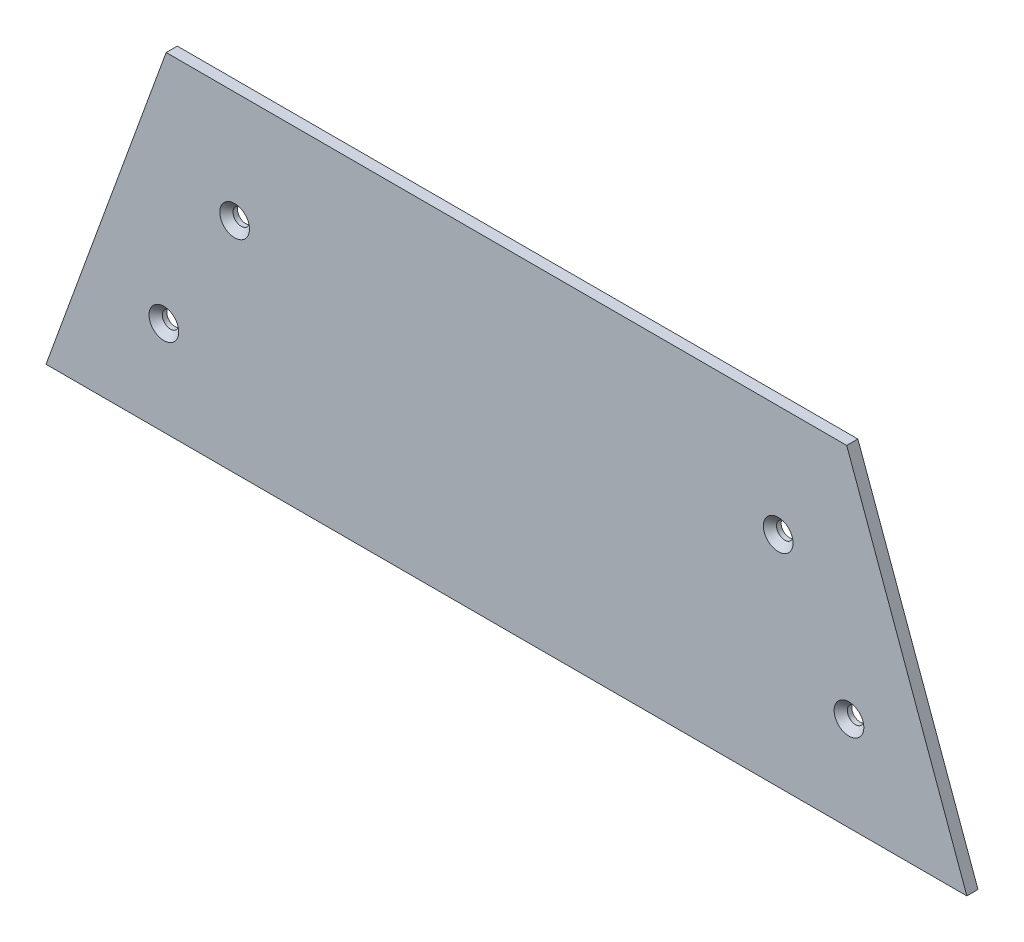
ISO-10303-21;
HEADER;
FILE_DESCRIPTION(('STEP AP214'),'2;1');
FILE_NAME('part.step','',(''),(''),'','','');
FILE_SCHEMA(('AUTOMOTIVE_DESIGN { 1 0 10303 214 1 1 1 1 }'));
ENDSEC;
DATA;
#1=APPLICATION_CONTEXT('core data for automotive mechanical design processes');
#2=APPLICATION_PROTOCOL_DEFINITION('international standard','automotive_design',2000,#1);
#3=PRODUCT_CONTEXT('',#1,'mechanical');
#4=PRODUCT('Part','Part','',(#3));
#5=PRODUCT_RELATED_PRODUCT_CATEGORY('part','',(#4));
#6=PRODUCT_DEFINITION_FORMATION('','',#4);
#7=PRODUCT_DEFINITION_CONTEXT('part definition',#1,'design');
#8=PRODUCT_DEFINITION('design','',#6,#7);
#9=PRODUCT_DEFINITION_SHAPE('','',#8);
#10=(LENGTH_UNIT() NAMED_UNIT(*) SI_UNIT(.MILLI.,.METRE.));
#11=(NAMED_UNIT(*) PLANE_ANGLE_UNIT() SI_UNIT($,.RADIAN.));
#12=(NAMED_UNIT(*) SI_UNIT($,.STERADIAN.) SOLID_ANGLE_UNIT());
#13=UNCERTAINTY_MEASURE_WITH_UNIT(LENGTH_MEASURE(1.E-05),#10,'distance_accuracy_value','');
#14=(GEOMETRIC_REPRESENTATION_CONTEXT(3) GLOBAL_UNCERTAINTY_ASSIGNED_CONTEXT((#13)) GLOBAL_UNIT_ASSIGNED_CONTEXT((#10,
#11,#12)) REPRESENTATION_CONTEXT('',''));
#15=CARTESIAN_POINT('',(0.,0.,0.));
#16=DIRECTION('',(0.,0.,1.));
#17=DIRECTION('',(1.,0.,0.));
#18=AXIS2_PLACEMENT_3D('',#15,#16,#17);
#19=CARTESIAN_POINT('',(-97.6385,35.,1.1811));
#20=DIRECTION('',(0.,-1.,0.));
#21=DIRECTION('',(0.,0.,-1.));
#22=AXIS2_PLACEMENT_3D('',#19,#20,#21);
#23=PLANE('',#22);
#24=DIRECTION('',(-1.,0.,0.));
#25=VECTOR('',#24,1.);
#26=CARTESIAN_POINT('',(-97.6385,35.,-1.1811));
#27=LINE('',#26,#25);
#28=CARTESIAN_POINT('',(72.1605836013662,35.,-1.1811));
#29=VERTEX_POINT('',#28);
#30=CARTESIAN_POINT('',(-72.1605836013663,35.,-1.1811));
#31=VERTEX_POINT('',#30);
#32=EDGE_CURVE('E82',#29,#31,#27,.T.);
#33=ORIENTED_EDGE('',*,*,#32,.T.);
#34=DIRECTION('',(0.,0.,1.));
#35=VECTOR('',#34,1.);
#36=CARTESIAN_POINT('',(-72.1605836013663,35.,-1.1821));
#37=LINE('',#36,#35);
#38=CARTESIAN_POINT('',(-72.1605836013663,35.,1.1811));
#39=VERTEX_POINT('',#38);
#40=EDGE_CURVE('E53',#31,#39,#37,.T.);
#41=ORIENTED_EDGE('',*,*,#40,.T.);
#42=DIRECTION('',(-1.,0.,0.));
#43=VECTOR('',#42,1.);
#44=CARTESIAN_POINT('',(-97.6385,35.,1.1811));
#45=LINE('',#44,#43);
#46=CARTESIAN_POINT('',(72.1605836013663,35.,1.1811));
#47=VERTEX_POINT('',#46);
#48=EDGE_CURVE('E93',#47,#39,#45,.T.);
#49=ORIENTED_EDGE('',*,*,#48,.F.);
#50=DIRECTION('',(0.,0.,1.));
#51=VECTOR('',#50,1.);
#52=CARTESIAN_POINT('',(72.1605836013663,35.,-1.1821));
#53=LINE('',#52,#51);
#54=EDGE_CURVE('E137',#29,#47,#53,.T.);
#55=ORIENTED_EDGE('',*,*,#54,.F.);
#56=EDGE_LOOP('',(#33,#41,#49,#55));
#57=FACE_BOUND('',#56,.T.);
#58=ADVANCED_FACE('F37',(#57),#23,.F.);
#59=CARTESIAN_POINT('',(-97.6385,-35.,1.1811));
#60=DIRECTION('',(0.,1.,0.));
#61=DIRECTION('',(0.,0.,1.));
#62=AXIS2_PLACEMENT_3D('',#59,#60,#61);
#63=PLANE('',#62);
#64=DIRECTION('',(1.,0.,0.));
#65=VECTOR('',#64,1.);
#66=CARTESIAN_POINT('',(-97.6385,-35.,-1.1811));
#67=LINE('',#66,#65);
#68=CARTESIAN_POINT('',(-97.6385,-35.,-1.1811));
#69=VERTEX_POINT('',#68);
#70=CARTESIAN_POINT('',(97.6385,-35.,-1.1811));
#71=VERTEX_POINT('',#70);
#72=EDGE_CURVE('E88',#69,#71,#67,.T.);
#73=ORIENTED_EDGE('',*,*,#72,.T.);
#74=DIRECTION('',(0.,0.,-1.));
#75=VECTOR('',#74,1.);
#76=CARTESIAN_POINT('',(97.6385,-35.,1.1811));
#77=LINE('',#76,#75);
#78=CARTESIAN_POINT('',(97.6385,-35.,1.1811));
#79=VERTEX_POINT('',#78);
#80=EDGE_CURVE('E45',#79,#71,#77,.T.);
#81=ORIENTED_EDGE('',*,*,#80,.F.);
#82=DIRECTION('',(1.,0.,0.));
#83=VECTOR('',#82,1.);
#84=CARTESIAN_POINT('',(-97.6385,-35.,1.1811));
#85=LINE('',#84,#83);
#86=CARTESIAN_POINT('',(-97.6385,-35.,1.1811));
#87=VERTEX_POINT('',#86);
#88=EDGE_CURVE('E90',#87,#79,#85,.T.);
#89=ORIENTED_EDGE('',*,*,#88,.F.);
#90=DIRECTION('',(0.,0.,-1.));
#91=VECTOR('',#90,1.);
#92=CARTESIAN_POINT('',(-97.6385,-35.,1.1811));
#93=LINE('',#92,#91);
#94=EDGE_CURVE('E11',#87,#69,#93,.T.);
#95=ORIENTED_EDGE('',*,*,#94,.T.);
#96=EDGE_LOOP('',(#73,#81,#89,#95));
#97=FACE_BOUND('',#96,.T.);
#98=ADVANCED_FACE('F87',(#97),#63,.F.);
#99=CARTESIAN_POINT('',(0.,0.,1.1811));
#100=DIRECTION('',(0.,0.,-1.));
#101=DIRECTION('',(-1.,0.,0.));
#102=AXIS2_PLACEMENT_3D('',#99,#100,#101);
#103=PLANE('',#102);
#104=CARTESIAN_POINT('',(-72.6378,-15.,1.1811));
#105=DIRECTION('',(0.,0.,1.));
#106=DIRECTION('',(1.,0.,0.));
#107=AXIS2_PLACEMENT_3D('',#104,#105,#106);
#108=CIRCLE('',#107,3.15);
#109=CARTESIAN_POINT('',(-69.4878,-15.,1.1811));
#110=VERTEX_POINT('',#109);
#111=EDGE_CURVE('E170',#110,#110,#108,.T.);
#112=ORIENTED_EDGE('',*,*,#111,.F.);
#113=EDGE_LOOP('',(#112));
#114=FACE_BOUND('',#113,.T.);
#115=CARTESIAN_POINT('',(-57.6378,11.3815573,1.1811));
#116=DIRECTION('',(0.,0.,1.));
#117=DIRECTION('',(1.,0.,0.));
#118=AXIS2_PLACEMENT_3D('',#115,#116,#117);
#119=CIRCLE('',#118,3.15);
#120=CARTESIAN_POINT('',(-54.4878,11.3815573,1.1811));
#121=VERTEX_POINT('',#120);
#122=EDGE_CURVE('E118',#121,#121,#119,.T.);
#123=ORIENTED_EDGE('',*,*,#122,.F.);
#124=EDGE_LOOP('',(#123));
#125=FACE_BOUND('',#124,.T.);
#126=CARTESIAN_POINT('',(57.6378,11.3815573,1.1811));
#127=DIRECTION('',(0.,0.,1.));
#128=DIRECTION('',(1.,0.,0.));
#129=AXIS2_PLACEMENT_3D('',#126,#127,#128);
#130=CIRCLE('',#129,3.15);
#131=CARTESIAN_POINT('',(60.7878,11.3815573,1.1811));
#132=VERTEX_POINT('',#131);
#133=EDGE_CURVE('E111',#132,#132,#130,.T.);
#134=ORIENTED_EDGE('',*,*,#133,.F.);
#135=EDGE_LOOP('',(#134));
#136=FACE_BOUND('',#135,.T.);
#137=CARTESIAN_POINT('',(72.6378,-15.,1.1811));
#138=DIRECTION('',(0.,0.,1.));
#139=DIRECTION('',(1.,0.,0.));
#140=AXIS2_PLACEMENT_3D('',#137,#138,#139);
#141=CIRCLE('',#140,3.15);
#142=CARTESIAN_POINT('',(75.7878,-15.,1.1811));
#143=VERTEX_POINT('',#142);
#144=EDGE_CURVE('E107',#143,#143,#141,.T.);
#145=ORIENTED_EDGE('',*,*,#144,.F.);
#146=EDGE_LOOP('',(#145));
#147=FACE_BOUND('',#146,.T.);
#148=ORIENTED_EDGE('',*,*,#48,.T.);
#149=DIRECTION('',(0.342020143325663,0.939692620785911,0.));
#150=VECTOR('',#149,1.);
#151=CARTESIAN_POINT('',(-72.1605836013663,35.,1.1811));
#152=LINE('',#151,#150);
#153=EDGE_CURVE('E132',#87,#39,#152,.T.);
#154=ORIENTED_EDGE('',*,*,#153,.F.);
#155=ORIENTED_EDGE('',*,*,#88,.T.);
#156=DIRECTION('',(0.342020143325663,-0.93969262078591,0.));
#157=VECTOR('',#156,1.);
#158=CARTESIAN_POINT('',(97.6385,-35.,1.1811));
#159=LINE('',#158,#157);
#160=EDGE_CURVE('E134',#47,#79,#159,.T.);
#161=ORIENTED_EDGE('',*,*,#160,.F.);
#162=EDGE_LOOP('',(#148,#154,#155,#161));
#163=FACE_BOUND('',#162,.T.);
#164=ADVANCED_FACE('F141',(#114,#125,#136,#147,#163),#103,.F.);
#165=CARTESIAN_POINT('',(0.,0.,-1.1811));
#166=DIRECTION('',(0.,0.,-1.));
#167=DIRECTION('',(-1.,0.,0.));
#168=AXIS2_PLACEMENT_3D('',#165,#166,#167);
#169=PLANE('',#168);
#170=CARTESIAN_POINT('',(-72.6378,-15.,-1.1811));
#171=DIRECTION('',(0.,0.,-1.));
#172=DIRECTION('',(-1.,0.,0.));
#173=AXIS2_PLACEMENT_3D('',#170,#171,#172);
#174=CIRCLE('',#173,1.75);
#175=CARTESIAN_POINT('',(-74.3878,-15.,-1.1811));
#176=VERTEX_POINT('',#175);
#177=EDGE_CURVE('E40',#176,#176,#174,.T.);
#178=ORIENTED_EDGE('',*,*,#177,.F.);
#179=EDGE_LOOP('',(#178));
#180=FACE_BOUND('',#179,.T.);
#181=CARTESIAN_POINT('',(-57.6378,11.3815573,-1.1811));
#182=DIRECTION('',(0.,0.,-1.));
#183=DIRECTION('',(-1.,0.,0.));
#184=AXIS2_PLACEMENT_3D('',#181,#182,#183);
#185=CIRCLE('',#184,1.75);
#186=CARTESIAN_POINT('',(-59.3878,11.3815573,-1.1811));
#187=VERTEX_POINT('',#186);
#188=EDGE_CURVE('E109',#187,#187,#185,.T.);
#189=ORIENTED_EDGE('',*,*,#188,.F.);
#190=EDGE_LOOP('',(#189));
#191=FACE_BOUND('',#190,.T.);
#192=CARTESIAN_POINT('',(57.6378,11.3815573,-1.1811));
#193=DIRECTION('',(0.,0.,-1.));
#194=DIRECTION('',(-1.,0.,0.));
#195=AXIS2_PLACEMENT_3D('',#192,#193,#194);
#196=CIRCLE('',#195,1.75);
#197=CARTESIAN_POINT('',(55.8878,11.3815573,-1.1811));
#198=VERTEX_POINT('',#197);
#199=EDGE_CURVE('E105',#198,#198,#196,.T.);
#200=ORIENTED_EDGE('',*,*,#199,.F.);
#201=EDGE_LOOP('',(#200));
#202=FACE_BOUND('',#201,.T.);
#203=CARTESIAN_POINT('',(72.6378,-15.,-1.1811));
#204=DIRECTION('',(0.,0.,-1.));
#205=DIRECTION('',(-1.,0.,0.));
#206=AXIS2_PLACEMENT_3D('',#203,#204,#205);
#207=CIRCLE('',#206,1.75);
#208=CARTESIAN_POINT('',(70.8878,-15.,-1.1811));
#209=VERTEX_POINT('',#208);
#210=EDGE_CURVE('E101',#209,#209,#207,.T.);
#211=ORIENTED_EDGE('',*,*,#210,.F.);
#212=EDGE_LOOP('',(#211));
#213=FACE_BOUND('',#212,.T.);
#214=DIRECTION('',(0.342020143325663,0.939692620785911,0.));
#215=VECTOR('',#214,1.);
#216=CARTESIAN_POINT('',(-72.1605836013663,35.,-1.1811));
#217=LINE('',#216,#215);
#218=EDGE_CURVE('E75',#69,#31,#217,.T.);
#219=ORIENTED_EDGE('',*,*,#218,.T.);
#220=ORIENTED_EDGE('',*,*,#32,.F.);
#221=DIRECTION('',(0.342020143325663,-0.939692620785911,0.));
#222=VECTOR('',#221,1.);
#223=CARTESIAN_POINT('',(97.6385,-35.,-1.1811));
#224=LINE('',#223,#222);
#225=EDGE_CURVE('E92',#29,#71,#224,.T.);
#226=ORIENTED_EDGE('',*,*,#225,.T.);
#227=ORIENTED_EDGE('',*,*,#72,.F.);
#228=EDGE_LOOP('',(#219,#220,#226,#227));
#229=FACE_BOUND('',#228,.T.);
#230=ADVANCED_FACE('F91',(#180,#191,#202,#213,#229),#169,.T.);
#231=CARTESIAN_POINT('',(97.6385,-35.,-1.1821));
#232=DIRECTION('',(-0.93969262078591,-0.342020143325663,0.));
#233=DIRECTION('',(0.342020143325663,-0.939692620785911,0.));
#234=AXIS2_PLACEMENT_3D('',#231,#232,#233);
#235=PLANE('',#234);
#236=ORIENTED_EDGE('',*,*,#54,.T.);
#237=ORIENTED_EDGE('',*,*,#160,.T.);
#238=ORIENTED_EDGE('',*,*,#80,.T.);
#239=ORIENTED_EDGE('',*,*,#225,.F.);
#240=EDGE_LOOP('',(#236,#237,#238,#239));
#241=FACE_BOUND('',#240,.T.);
#242=ADVANCED_FACE('F145',(#241),#235,.F.);
#243=CARTESIAN_POINT('',(-72.1605836013663,35.,-1.1821));
#244=DIRECTION('',(0.939692620785911,-0.342020143325663,0.));
#245=DIRECTION('',(0.342020143325663,0.939692620785911,0.));
#246=AXIS2_PLACEMENT_3D('',#243,#244,#245);
#247=PLANE('',#246);
#248=ORIENTED_EDGE('',*,*,#94,.F.);
#249=ORIENTED_EDGE('',*,*,#153,.T.);
#250=ORIENTED_EDGE('',*,*,#40,.F.);
#251=ORIENTED_EDGE('',*,*,#218,.F.);
#252=EDGE_LOOP('',(#248,#249,#250,#251));
#253=FACE_BOUND('',#252,.T.);
#254=ADVANCED_FACE('F76',(#253),#247,.F.);
#255=CARTESIAN_POINT('',(72.6378,-15.,1.1811));
#256=DIRECTION('',(0.,0.,1.));
#257=DIRECTION('',(1.,0.,0.));
#258=AXIS2_PLACEMENT_3D('',#255,#256,#257);
#259=CYLINDRICAL_SURFACE('',#258,1.75);
#260=ORIENTED_EDGE('',*,*,#210,.T.);
#261=EDGE_LOOP('',(#260));
#262=FACE_BOUND('',#261,.T.);
#263=CARTESIAN_POINT('',(72.6378,-15.,-0.2189));
#264=DIRECTION('',(0.,0.,1.));
#265=DIRECTION('',(1.,0.,0.));
#266=AXIS2_PLACEMENT_3D('',#263,#264,#265);
#267=CIRCLE('',#266,1.75);
#268=CARTESIAN_POINT('',(74.3878,-15.,-0.2189));
#269=VERTEX_POINT('',#268);
#270=EDGE_CURVE('E104',#269,#269,#267,.T.);
#271=ORIENTED_EDGE('',*,*,#270,.T.);
#272=EDGE_LOOP('',(#271));
#273=FACE_BOUND('',#272,.T.);
#274=ADVANCED_FACE('F152',(#262,#273),#259,.F.);
#275=CARTESIAN_POINT('',(72.6378,-15.,1.1811));
#276=DIRECTION('',(0.,0.,1.));
#277=DIRECTION('',(1.,0.,0.));
#278=AXIS2_PLACEMENT_3D('',#275,#276,#277);
#279=CONICAL_SURFACE('',#278,3.15,0.785398163397448);
#280=ORIENTED_EDGE('',*,*,#270,.F.);
#281=EDGE_LOOP('',(#280));
#282=FACE_BOUND('',#281,.T.);
#283=ORIENTED_EDGE('',*,*,#144,.T.);
#284=EDGE_LOOP('',(#283));
#285=FACE_BOUND('',#284,.T.);
#286=ADVANCED_FACE('F177',(#282,#285),#279,.F.);
#287=CARTESIAN_POINT('',(57.6378,11.3815573,1.1811));
#288=DIRECTION('',(0.,0.,1.));
#289=DIRECTION('',(1.,0.,0.));
#290=AXIS2_PLACEMENT_3D('',#287,#288,#289);
#291=CYLINDRICAL_SURFACE('',#290,1.75);
#292=ORIENTED_EDGE('',*,*,#199,.T.);
#293=EDGE_LOOP('',(#292));
#294=FACE_BOUND('',#293,.T.);
#295=CARTESIAN_POINT('',(57.6378,11.3815573,-0.2189));
#296=DIRECTION('',(0.,0.,1.));
#297=DIRECTION('',(1.,0.,0.));
#298=AXIS2_PLACEMENT_3D('',#295,#296,#297);
#299=CIRCLE('',#298,1.75);
#300=CARTESIAN_POINT('',(59.3878,11.3815573,-0.2189));
#301=VERTEX_POINT('',#300);
#302=EDGE_CURVE('E108',#301,#301,#299,.T.);
#303=ORIENTED_EDGE('',*,*,#302,.T.);
#304=EDGE_LOOP('',(#303));
#305=FACE_BOUND('',#304,.T.);
#306=ADVANCED_FACE('F179',(#294,#305),#291,.F.);
#307=CARTESIAN_POINT('',(57.6378,11.3815573,1.1811));
#308=DIRECTION('',(0.,0.,1.));
#309=DIRECTION('',(1.,0.,0.));
#310=AXIS2_PLACEMENT_3D('',#307,#308,#309);
#311=CONICAL_SURFACE('',#310,3.15,0.785398163397448);
#312=ORIENTED_EDGE('',*,*,#302,.F.);
#313=EDGE_LOOP('',(#312));
#314=FACE_BOUND('',#313,.T.);
#315=ORIENTED_EDGE('',*,*,#133,.T.);
#316=EDGE_LOOP('',(#315));
#317=FACE_BOUND('',#316,.T.);
#318=ADVANCED_FACE('F186',(#314,#317),#311,.F.);
#319=CARTESIAN_POINT('',(-57.6378,11.3815573,1.1811));
#320=DIRECTION('',(0.,0.,1.));
#321=DIRECTION('',(1.,0.,0.));
#322=AXIS2_PLACEMENT_3D('',#319,#320,#321);
#323=CYLINDRICAL_SURFACE('',#322,1.75);
#324=ORIENTED_EDGE('',*,*,#188,.T.);
#325=EDGE_LOOP('',(#324));
#326=FACE_BOUND('',#325,.T.);
#327=CARTESIAN_POINT('',(-57.6378,11.3815573,-0.2189));
#328=DIRECTION('',(0.,0.,1.));
#329=DIRECTION('',(1.,0.,0.));
#330=AXIS2_PLACEMENT_3D('',#327,#328,#329);
#331=CIRCLE('',#330,1.75);
#332=CARTESIAN_POINT('',(-55.8878,11.3815573,-0.2189));
#333=VERTEX_POINT('',#332);
#334=EDGE_CURVE('E112',#333,#333,#331,.T.);
#335=ORIENTED_EDGE('',*,*,#334,.T.);
#336=EDGE_LOOP('',(#335));
#337=FACE_BOUND('',#336,.T.);
#338=ADVANCED_FACE('F195',(#326,#337),#323,.F.);
#339=CARTESIAN_POINT('',(-57.6378,11.3815573,1.1811));
#340=DIRECTION('',(0.,0.,1.));
#341=DIRECTION('',(1.,0.,0.));
#342=AXIS2_PLACEMENT_3D('',#339,#340,#341);
#343=CONICAL_SURFACE('',#342,3.15,0.785398163397448);
#344=ORIENTED_EDGE('',*,*,#334,.F.);
#345=EDGE_LOOP('',(#344));
#346=FACE_BOUND('',#345,.T.);
#347=ORIENTED_EDGE('',*,*,#122,.T.);
#348=EDGE_LOOP('',(#347));
#349=FACE_BOUND('',#348,.T.);
#350=ADVANCED_FACE('F199',(#346,#349),#343,.F.);
#351=CARTESIAN_POINT('',(-72.6378,-15.,1.1811));
#352=DIRECTION('',(0.,0.,1.));
#353=DIRECTION('',(1.,0.,0.));
#354=AXIS2_PLACEMENT_3D('',#351,#352,#353);
#355=CYLINDRICAL_SURFACE('',#354,1.75);
#356=ORIENTED_EDGE('',*,*,#177,.T.);
#357=EDGE_LOOP('',(#356));
#358=FACE_BOUND('',#357,.T.);
#359=CARTESIAN_POINT('',(-72.6378,-15.,-0.2189));
#360=DIRECTION('',(0.,0.,1.));
#361=DIRECTION('',(1.,0.,0.));
#362=AXIS2_PLACEMENT_3D('',#359,#360,#361);
#363=CIRCLE('',#362,1.75);
#364=CARTESIAN_POINT('',(-70.8878,-15.,-0.2189));
#365=VERTEX_POINT('',#364);
#366=EDGE_CURVE('E215',#365,#365,#363,.T.);
#367=ORIENTED_EDGE('',*,*,#366,.T.);
#368=EDGE_LOOP('',(#367));
#369=FACE_BOUND('',#368,.T.);
#370=ADVANCED_FACE('F202',(#358,#369),#355,.F.);
#371=CARTESIAN_POINT('',(-72.6378,-15.,1.1811));
#372=DIRECTION('',(0.,0.,1.));
#373=DIRECTION('',(1.,0.,0.));
#374=AXIS2_PLACEMENT_3D('',#371,#372,#373);
#375=CONICAL_SURFACE('',#374,3.15,0.785398163397448);
#376=ORIENTED_EDGE('',*,*,#366,.F.);
#377=EDGE_LOOP('',(#376));
#378=FACE_BOUND('',#377,.T.);
#379=ORIENTED_EDGE('',*,*,#111,.T.);
#380=EDGE_LOOP('',(#379));
#381=FACE_BOUND('',#380,.T.);
#382=ADVANCED_FACE('F206',(#378,#381),#375,.F.);
#383=CLOSED_SHELL('',(#58,#98,#164,#230,#242,#254,#274,#286,#306,#318,#338,#350,#370,#382));
#384=MANIFOLD_SOLID_BREP('B2',#383);
#385=ADVANCED_BREP_SHAPE_REPRESENTATION('',(#18,#384),#14);
#386=SHAPE_DEFINITION_REPRESENTATION(#9,#385);
ENDSEC;
END-ISO-10303-21;
